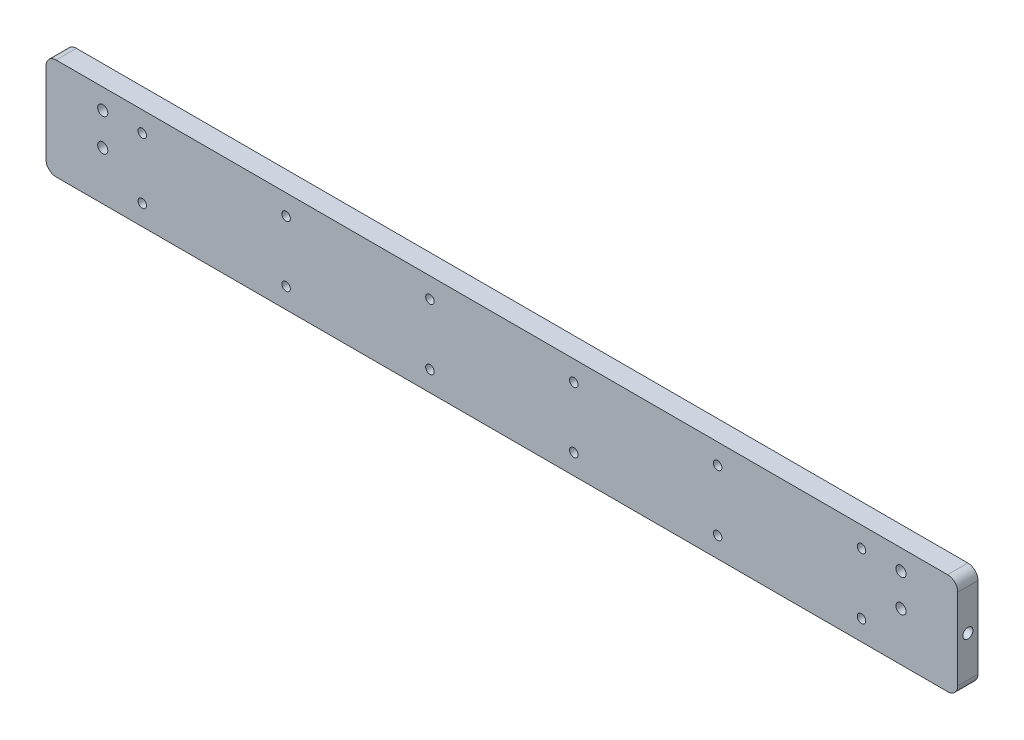
ISO-10303-21;
HEADER;
FILE_DESCRIPTION(('STEP AP214'),'2;1');
FILE_NAME('part.step','',(''),(''),'','','');
FILE_SCHEMA(('AUTOMOTIVE_DESIGN { 1 0 10303 214 1 1 1 1 }'));
ENDSEC;
DATA;
#1=APPLICATION_CONTEXT('core data for automotive mechanical design processes');
#2=APPLICATION_PROTOCOL_DEFINITION('international standard','automotive_design',2000,#1);
#3=PRODUCT_CONTEXT('',#1,'mechanical');
#4=PRODUCT('Part','Part','',(#3));
#5=PRODUCT_RELATED_PRODUCT_CATEGORY('part','',(#4));
#6=PRODUCT_DEFINITION_FORMATION('','',#4);
#7=PRODUCT_DEFINITION_CONTEXT('part definition',#1,'design');
#8=PRODUCT_DEFINITION('design','',#6,#7);
#9=PRODUCT_DEFINITION_SHAPE('','',#8);
#10=(LENGTH_UNIT() NAMED_UNIT(*) SI_UNIT(.MILLI.,.METRE.));
#11=(NAMED_UNIT(*) PLANE_ANGLE_UNIT() SI_UNIT($,.RADIAN.));
#12=(NAMED_UNIT(*) SI_UNIT($,.STERADIAN.) SOLID_ANGLE_UNIT());
#13=UNCERTAINTY_MEASURE_WITH_UNIT(LENGTH_MEASURE(1.E-05),#10,'distance_accuracy_value','');
#14=(GEOMETRIC_REPRESENTATION_CONTEXT(3) GLOBAL_UNCERTAINTY_ASSIGNED_CONTEXT((#13)) GLOBAL_UNIT_ASSIGNED_CONTEXT((#10,
#11,#12)) REPRESENTATION_CONTEXT('',''));
#15=CARTESIAN_POINT('',(0.,0.,0.));
#16=DIRECTION('',(0.,0.,1.));
#17=DIRECTION('',(1.,0.,0.));
#18=AXIS2_PLACEMENT_3D('',#15,#16,#17);
#19=CARTESIAN_POINT('',(0.,0.,10.));
#20=DIRECTION('',(1.,0.,0.));
#21=DIRECTION('',(0.,0.,-1.));
#22=AXIS2_PLACEMENT_3D('',#19,#20,#21);
#23=PLANE('',#22);
#24=CARTESIAN_POINT('',(0.,25.,5.));
#25=DIRECTION('',(-1.,0.,0.));
#26=DIRECTION('',(0.,0.,1.));
#27=AXIS2_PLACEMENT_3D('',#24,#25,#26);
#28=CIRCLE('',#27,2.5);
#29=CARTESIAN_POINT('',(0.,25.,7.49999999999999));
#30=VERTEX_POINT('',#29);
#31=EDGE_CURVE('E133',#30,#30,#28,.T.);
#32=ORIENTED_EDGE('',*,*,#31,.F.);
#33=EDGE_LOOP('',(#32));
#34=FACE_BOUND('',#33,.T.);
#35=DIRECTION('',(0.,-1.,0.));
#36=VECTOR('',#35,1.);
#37=CARTESIAN_POINT('',(0.,0.,10.));
#38=LINE('',#37,#36);
#39=CARTESIAN_POINT('',(0.,45.,10.));
#40=VERTEX_POINT('',#39);
#41=CARTESIAN_POINT('',(0.,5.,10.));
#42=VERTEX_POINT('',#41);
#43=EDGE_CURVE('E120',#40,#42,#38,.T.);
#44=ORIENTED_EDGE('',*,*,#43,.F.);
#45=DIRECTION('',(0.,0.,-1.));
#46=VECTOR('',#45,1.);
#47=CARTESIAN_POINT('',(0.,45.,10.));
#48=LINE('',#47,#46);
#49=CARTESIAN_POINT('',(0.,45.,0.));
#50=VERTEX_POINT('',#49);
#51=EDGE_CURVE('E105',#40,#50,#48,.T.);
#52=ORIENTED_EDGE('',*,*,#51,.T.);
#53=DIRECTION('',(0.,-1.,0.));
#54=VECTOR('',#53,1.);
#55=CARTESIAN_POINT('',(0.,0.,0.));
#56=LINE('',#55,#54);
#57=CARTESIAN_POINT('',(0.,5.,0.));
#58=VERTEX_POINT('',#57);
#59=EDGE_CURVE('E117',#50,#58,#56,.T.);
#60=ORIENTED_EDGE('',*,*,#59,.T.);
#61=DIRECTION('',(0.,0.,-1.));
#62=VECTOR('',#61,1.);
#63=CARTESIAN_POINT('',(0.,5.,10.));
#64=LINE('',#63,#62);
#65=EDGE_CURVE('E122',#58,#42,#64,.F.);
#66=ORIENTED_EDGE('',*,*,#65,.T.);
#67=EDGE_LOOP('',(#44,#52,#60,#66));
#68=FACE_BOUND('',#67,.T.);
#69=ADVANCED_FACE('F33',(#34,#68),#23,.F.);
#70=CARTESIAN_POINT('',(0.,0.,10.));
#71=DIRECTION('',(0.,1.,0.));
#72=DIRECTION('',(0.,0.,1.));
#73=AXIS2_PLACEMENT_3D('',#70,#71,#72);
#74=PLANE('',#73);
#75=DIRECTION('',(1.,0.,0.));
#76=VECTOR('',#75,1.);
#77=CARTESIAN_POINT('',(0.,0.,10.));
#78=LINE('',#77,#76);
#79=CARTESIAN_POINT('',(5.,0.,10.));
#80=VERTEX_POINT('',#79);
#81=CARTESIAN_POINT('',(445.,0.,10.));
#82=VERTEX_POINT('',#81);
#83=EDGE_CURVE('E218',#80,#82,#78,.T.);
#84=ORIENTED_EDGE('',*,*,#83,.F.);
#85=DIRECTION('',(0.,0.,-1.));
#86=VECTOR('',#85,1.);
#87=CARTESIAN_POINT('',(5.,0.,10.));
#88=LINE('',#87,#86);
#89=CARTESIAN_POINT('',(5.,0.,0.));
#90=VERTEX_POINT('',#89);
#91=EDGE_CURVE('E159',#80,#90,#88,.T.);
#92=ORIENTED_EDGE('',*,*,#91,.T.);
#93=DIRECTION('',(1.,0.,0.));
#94=VECTOR('',#93,1.);
#95=CARTESIAN_POINT('',(0.,0.,0.));
#96=LINE('',#95,#94);
#97=CARTESIAN_POINT('',(445.,0.,0.));
#98=VERTEX_POINT('',#97);
#99=EDGE_CURVE('E126',#90,#98,#96,.T.);
#100=ORIENTED_EDGE('',*,*,#99,.T.);
#101=DIRECTION('',(0.,0.,-1.));
#102=VECTOR('',#101,1.);
#103=CARTESIAN_POINT('',(445.,0.,10.));
#104=LINE('',#103,#102);
#105=EDGE_CURVE('E157',#98,#82,#104,.F.);
#106=ORIENTED_EDGE('',*,*,#105,.T.);
#107=EDGE_LOOP('',(#84,#92,#100,#106));
#108=FACE_BOUND('',#107,.T.);
#109=ADVANCED_FACE('F236',(#108),#74,.F.);
#110=CARTESIAN_POINT('',(450.,0.,10.));
#111=DIRECTION('',(-1.,0.,0.));
#112=DIRECTION('',(0.,0.,1.));
#113=AXIS2_PLACEMENT_3D('',#110,#111,#112);
#114=PLANE('',#113);
#115=CARTESIAN_POINT('',(450.,25.,5.));
#116=DIRECTION('',(-1.,0.,0.));
#117=DIRECTION('',(0.,0.,1.));
#118=AXIS2_PLACEMENT_3D('',#115,#116,#117);
#119=CIRCLE('',#118,2.5);
#120=CARTESIAN_POINT('',(450.,25.,7.49999999999999));
#121=VERTEX_POINT('',#120);
#122=EDGE_CURVE('E166',#121,#121,#119,.T.);
#123=ORIENTED_EDGE('',*,*,#122,.T.);
#124=EDGE_LOOP('',(#123));
#125=FACE_BOUND('',#124,.T.);
#126=DIRECTION('',(0.,1.,0.));
#127=VECTOR('',#126,1.);
#128=CARTESIAN_POINT('',(450.,0.,10.));
#129=LINE('',#128,#127);
#130=CARTESIAN_POINT('',(450.,5.,10.));
#131=VERTEX_POINT('',#130);
#132=CARTESIAN_POINT('',(450.,45.,10.));
#133=VERTEX_POINT('',#132);
#134=EDGE_CURVE('E219',#131,#133,#129,.T.);
#135=ORIENTED_EDGE('',*,*,#134,.F.);
#136=DIRECTION('',(0.,0.,-1.));
#137=VECTOR('',#136,1.);
#138=CARTESIAN_POINT('',(450.,5.,10.));
#139=LINE('',#138,#137);
#140=CARTESIAN_POINT('',(450.,5.,0.));
#141=VERTEX_POINT('',#140);
#142=EDGE_CURVE('E11',#131,#141,#139,.T.);
#143=ORIENTED_EDGE('',*,*,#142,.T.);
#144=DIRECTION('',(0.,1.,0.));
#145=VECTOR('',#144,1.);
#146=CARTESIAN_POINT('',(450.,0.,0.));
#147=LINE('',#146,#145);
#148=CARTESIAN_POINT('',(450.,45.,0.));
#149=VERTEX_POINT('',#148);
#150=EDGE_CURVE('E130',#141,#149,#147,.T.);
#151=ORIENTED_EDGE('',*,*,#150,.T.);
#152=DIRECTION('',(0.,0.,-1.));
#153=VECTOR('',#152,1.);
#154=CARTESIAN_POINT('',(450.,45.,10.));
#155=LINE('',#154,#153);
#156=EDGE_CURVE('E42',#149,#133,#155,.F.);
#157=ORIENTED_EDGE('',*,*,#156,.T.);
#158=EDGE_LOOP('',(#135,#143,#151,#157));
#159=FACE_BOUND('',#158,.T.);
#160=ADVANCED_FACE('F229',(#125,#159),#114,.F.);
#161=CARTESIAN_POINT('',(0.,50.,10.));
#162=DIRECTION('',(0.,-1.,0.));
#163=DIRECTION('',(0.,0.,-1.));
#164=AXIS2_PLACEMENT_3D('',#161,#162,#163);
#165=PLANE('',#164);
#166=DIRECTION('',(-1.,0.,0.));
#167=VECTOR('',#166,1.);
#168=CARTESIAN_POINT('',(0.,50.,0.));
#169=LINE('',#168,#167);
#170=CARTESIAN_POINT('',(445.,50.,0.));
#171=VERTEX_POINT('',#170);
#172=CARTESIAN_POINT('',(5.,50.,0.));
#173=VERTEX_POINT('',#172);
#174=EDGE_CURVE('E140',#171,#173,#169,.T.);
#175=ORIENTED_EDGE('',*,*,#174,.T.);
#176=DIRECTION('',(0.,0.,-1.));
#177=VECTOR('',#176,1.);
#178=CARTESIAN_POINT('',(5.,50.,10.));
#179=LINE('',#178,#177);
#180=CARTESIAN_POINT('',(5.,50.,10.));
#181=VERTEX_POINT('',#180);
#182=EDGE_CURVE('E106',#173,#181,#179,.F.);
#183=ORIENTED_EDGE('',*,*,#182,.T.);
#184=DIRECTION('',(-1.,0.,0.));
#185=VECTOR('',#184,1.);
#186=CARTESIAN_POINT('',(0.,50.,10.));
#187=LINE('',#186,#185);
#188=CARTESIAN_POINT('',(445.,50.,10.));
#189=VERTEX_POINT('',#188);
#190=EDGE_CURVE('E136',#189,#181,#187,.T.);
#191=ORIENTED_EDGE('',*,*,#190,.F.);
#192=DIRECTION('',(0.,0.,-1.));
#193=VECTOR('',#192,1.);
#194=CARTESIAN_POINT('',(445.,50.,10.));
#195=LINE('',#194,#193);
#196=EDGE_CURVE('E111',#189,#171,#195,.T.);
#197=ORIENTED_EDGE('',*,*,#196,.T.);
#198=EDGE_LOOP('',(#175,#183,#191,#197));
#199=FACE_BOUND('',#198,.T.);
#200=ADVANCED_FACE('F226',(#199),#165,.F.);
#201=CARTESIAN_POINT('',(0.,0.,10.));
#202=DIRECTION('',(0.,0.,-1.));
#203=DIRECTION('',(-1.,0.,0.));
#204=AXIS2_PLACEMENT_3D('',#201,#202,#203);
#205=PLANE('',#204);
#206=CARTESIAN_POINT('',(28.,24.,10.));
#207=DIRECTION('',(0.,0.,-1.));
#208=DIRECTION('',(-1.,0.,0.));
#209=AXIS2_PLACEMENT_3D('',#206,#207,#208);
#210=CIRCLE('',#209,2.5);
#211=CARTESIAN_POINT('',(25.5,24.,10.));
#212=VERTEX_POINT('',#211);
#213=EDGE_CURVE('E353',#212,#212,#210,.T.);
#214=ORIENTED_EDGE('',*,*,#213,.T.);
#215=EDGE_LOOP('',(#214));
#216=FACE_BOUND('',#215,.T.);
#217=CARTESIAN_POINT('',(422.,24.,10.));
#218=DIRECTION('',(0.,0.,-1.));
#219=DIRECTION('',(-1.,0.,0.));
#220=AXIS2_PLACEMENT_3D('',#217,#218,#219);
#221=CIRCLE('',#220,2.50000000000008);
#222=CARTESIAN_POINT('',(419.5,24.,10.));
#223=VERTEX_POINT('',#222);
#224=EDGE_CURVE('E355',#223,#223,#221,.T.);
#225=ORIENTED_EDGE('',*,*,#224,.T.);
#226=EDGE_LOOP('',(#225));
#227=FACE_BOUND('',#226,.T.);
#228=CARTESIAN_POINT('',(422.,40.,10.));
#229=DIRECTION('',(0.,0.,-1.));
#230=DIRECTION('',(-1.,0.,0.));
#231=AXIS2_PLACEMENT_3D('',#228,#229,#230);
#232=CIRCLE('',#231,2.50000000000008);
#233=CARTESIAN_POINT('',(419.5,40.,10.));
#234=VERTEX_POINT('',#233);
#235=EDGE_CURVE('E361',#234,#234,#232,.T.);
#236=ORIENTED_EDGE('',*,*,#235,.T.);
#237=EDGE_LOOP('',(#236));
#238=FACE_BOUND('',#237,.T.);
#239=CARTESIAN_POINT('',(28.,40.,10.));
#240=DIRECTION('',(0.,0.,-1.));
#241=DIRECTION('',(-1.,0.,0.));
#242=AXIS2_PLACEMENT_3D('',#239,#240,#241);
#243=CIRCLE('',#242,2.5);
#244=CARTESIAN_POINT('',(25.5,40.,10.));
#245=VERTEX_POINT('',#244);
#246=EDGE_CURVE('E358',#245,#245,#243,.T.);
#247=ORIENTED_EDGE('',*,*,#246,.T.);
#248=EDGE_LOOP('',(#247));
#249=FACE_BOUND('',#248,.T.);
#250=CARTESIAN_POINT('',(402.5,9.99999999999998,10.));
#251=DIRECTION('',(0.,0.,-1.));
#252=DIRECTION('',(1.,0.,0.));
#253=AXIS2_PLACEMENT_3D('',#250,#251,#252);
#254=CIRCLE('',#253,2.09999999999999);
#255=CARTESIAN_POINT('',(404.6,9.99999999999998,10.));
#256=VERTEX_POINT('',#255);
#257=EDGE_CURVE('E375',#256,#256,#254,.T.);
#258=ORIENTED_EDGE('',*,*,#257,.T.);
#259=EDGE_LOOP('',(#258));
#260=FACE_BOUND('',#259,.T.);
#261=CARTESIAN_POINT('',(402.5,40.,10.));
#262=DIRECTION('',(0.,0.,-1.));
#263=DIRECTION('',(-1.,0.,0.));
#264=AXIS2_PLACEMENT_3D('',#261,#262,#263);
#265=CIRCLE('',#264,2.09999999999999);
#266=CARTESIAN_POINT('',(400.4,40.,10.));
#267=VERTEX_POINT('',#266);
#268=EDGE_CURVE('E372',#267,#267,#265,.T.);
#269=ORIENTED_EDGE('',*,*,#268,.T.);
#270=EDGE_LOOP('',(#269));
#271=FACE_BOUND('',#270,.T.);
#272=CARTESIAN_POINT('',(331.5,40.,10.));
#273=DIRECTION('',(0.,0.,-1.));
#274=DIRECTION('',(1.,0.,0.));
#275=AXIS2_PLACEMENT_3D('',#272,#273,#274);
#276=CIRCLE('',#275,2.09999999999999);
#277=CARTESIAN_POINT('',(333.6,40.,10.));
#278=VERTEX_POINT('',#277);
#279=EDGE_CURVE('E368',#278,#278,#276,.T.);
#280=ORIENTED_EDGE('',*,*,#279,.T.);
#281=EDGE_LOOP('',(#280));
#282=FACE_BOUND('',#281,.T.);
#283=CARTESIAN_POINT('',(331.5,9.99999999999998,10.));
#284=DIRECTION('',(0.,0.,-1.));
#285=DIRECTION('',(-1.,0.,0.));
#286=AXIS2_PLACEMENT_3D('',#283,#284,#285);
#287=CIRCLE('',#286,2.09999999999999);
#288=CARTESIAN_POINT('',(329.4,9.99999999999998,10.));
#289=VERTEX_POINT('',#288);
#290=EDGE_CURVE('E371',#289,#289,#287,.T.);
#291=ORIENTED_EDGE('',*,*,#290,.T.);
#292=EDGE_LOOP('',(#291));
#293=FACE_BOUND('',#292,.T.);
#294=CARTESIAN_POINT('',(260.5,9.99999999999998,10.));
#295=DIRECTION('',(0.,0.,-1.));
#296=DIRECTION('',(1.,0.,0.));
#297=AXIS2_PLACEMENT_3D('',#294,#295,#296);
#298=CIRCLE('',#297,2.09999999999999);
#299=CARTESIAN_POINT('',(262.6,9.99999999999998,10.));
#300=VERTEX_POINT('',#299);
#301=EDGE_CURVE('E172',#300,#300,#298,.T.);
#302=ORIENTED_EDGE('',*,*,#301,.T.);
#303=EDGE_LOOP('',(#302));
#304=FACE_BOUND('',#303,.T.);
#305=CARTESIAN_POINT('',(189.5,40.,10.));
#306=DIRECTION('',(0.,0.,-1.));
#307=DIRECTION('',(1.,0.,0.));
#308=AXIS2_PLACEMENT_3D('',#305,#306,#307);
#309=CIRCLE('',#308,2.09999999999999);
#310=CARTESIAN_POINT('',(191.6,40.,10.));
#311=VERTEX_POINT('',#310);
#312=EDGE_CURVE('E367',#311,#311,#309,.T.);
#313=ORIENTED_EDGE('',*,*,#312,.T.);
#314=EDGE_LOOP('',(#313));
#315=FACE_BOUND('',#314,.T.);
#316=CARTESIAN_POINT('',(189.5,9.99999999999999,10.));
#317=DIRECTION('',(0.,0.,-1.));
#318=DIRECTION('',(-1.,0.,0.));
#319=AXIS2_PLACEMENT_3D('',#316,#317,#318);
#320=CIRCLE('',#319,2.09999999999999);
#321=CARTESIAN_POINT('',(187.4,9.99999999999999,10.));
#322=VERTEX_POINT('',#321);
#323=EDGE_CURVE('E386',#322,#322,#320,.T.);
#324=ORIENTED_EDGE('',*,*,#323,.T.);
#325=EDGE_LOOP('',(#324));
#326=FACE_BOUND('',#325,.T.);
#327=CARTESIAN_POINT('',(118.5,9.99999999999999,10.));
#328=DIRECTION('',(0.,0.,-1.));
#329=DIRECTION('',(1.,0.,0.));
#330=AXIS2_PLACEMENT_3D('',#327,#328,#329);
#331=CIRCLE('',#330,2.09999999999999);
#332=CARTESIAN_POINT('',(120.6,9.99999999999999,10.));
#333=VERTEX_POINT('',#332);
#334=EDGE_CURVE('E383',#333,#333,#331,.T.);
#335=ORIENTED_EDGE('',*,*,#334,.T.);
#336=EDGE_LOOP('',(#335));
#337=FACE_BOUND('',#336,.T.);
#338=CARTESIAN_POINT('',(118.5,40.,10.));
#339=DIRECTION('',(0.,0.,-1.));
#340=DIRECTION('',(-1.,0.,0.));
#341=AXIS2_PLACEMENT_3D('',#338,#339,#340);
#342=CIRCLE('',#341,2.09999999999999);
#343=CARTESIAN_POINT('',(116.4,40.,10.));
#344=VERTEX_POINT('',#343);
#345=EDGE_CURVE('E208',#344,#344,#342,.T.);
#346=ORIENTED_EDGE('',*,*,#345,.T.);
#347=EDGE_LOOP('',(#346));
#348=FACE_BOUND('',#347,.T.);
#349=CARTESIAN_POINT('',(47.5,40.,10.));
#350=DIRECTION('',(0.,0.,-1.));
#351=DIRECTION('',(1.,0.,0.));
#352=AXIS2_PLACEMENT_3D('',#349,#350,#351);
#353=CIRCLE('',#352,2.09999999999999);
#354=CARTESIAN_POINT('',(49.6,40.,10.));
#355=VERTEX_POINT('',#354);
#356=EDGE_CURVE('E392',#355,#355,#353,.T.);
#357=ORIENTED_EDGE('',*,*,#356,.T.);
#358=EDGE_LOOP('',(#357));
#359=FACE_BOUND('',#358,.T.);
#360=CARTESIAN_POINT('',(47.5,10.,10.));
#361=DIRECTION('',(0.,0.,-1.));
#362=DIRECTION('',(-1.,0.,0.));
#363=AXIS2_PLACEMENT_3D('',#360,#361,#362);
#364=CIRCLE('',#363,2.09999999999999);
#365=CARTESIAN_POINT('',(45.4,10.,10.));
#366=VERTEX_POINT('',#365);
#367=EDGE_CURVE('E378',#366,#366,#364,.T.);
#368=ORIENTED_EDGE('',*,*,#367,.T.);
#369=EDGE_LOOP('',(#368));
#370=FACE_BOUND('',#369,.T.);
#371=CARTESIAN_POINT('',(260.5,40.,10.));
#372=DIRECTION('',(0.,0.,-1.));
#373=DIRECTION('',(-1.,0.,0.));
#374=AXIS2_PLACEMENT_3D('',#371,#372,#373);
#375=CIRCLE('',#374,2.09999999999999);
#376=CARTESIAN_POINT('',(258.4,40.,10.));
#377=VERTEX_POINT('',#376);
#378=EDGE_CURVE('E167',#377,#377,#375,.T.);
#379=ORIENTED_EDGE('',*,*,#378,.T.);
#380=EDGE_LOOP('',(#379));
#381=FACE_BOUND('',#380,.T.);
#382=ORIENTED_EDGE('',*,*,#190,.T.);
#383=CARTESIAN_POINT('',(5.,45.,10.));
#384=DIRECTION('',(0.,0.,-1.));
#385=DIRECTION('',(-1.,0.,0.));
#386=AXIS2_PLACEMENT_3D('',#383,#384,#385);
#387=CIRCLE('',#386,5.);
#388=EDGE_CURVE('E155',#181,#40,#387,.F.);
#389=ORIENTED_EDGE('',*,*,#388,.T.);
#390=ORIENTED_EDGE('',*,*,#43,.T.);
#391=CARTESIAN_POINT('',(5.,5.,10.));
#392=DIRECTION('',(0.,0.,-1.));
#393=DIRECTION('',(-1.,0.,0.));
#394=AXIS2_PLACEMENT_3D('',#391,#392,#393);
#395=CIRCLE('',#394,5.);
#396=EDGE_CURVE('E153',#42,#80,#395,.F.);
#397=ORIENTED_EDGE('',*,*,#396,.T.);
#398=ORIENTED_EDGE('',*,*,#83,.T.);
#399=CARTESIAN_POINT('',(445.,5.,10.));
#400=DIRECTION('',(0.,0.,-1.));
#401=DIRECTION('',(-1.,0.,0.));
#402=AXIS2_PLACEMENT_3D('',#399,#400,#401);
#403=CIRCLE('',#402,5.);
#404=EDGE_CURVE('E56',#82,#131,#403,.F.);
#405=ORIENTED_EDGE('',*,*,#404,.T.);
#406=ORIENTED_EDGE('',*,*,#134,.T.);
#407=CARTESIAN_POINT('',(445.,45.,10.));
#408=DIRECTION('',(0.,0.,-1.));
#409=DIRECTION('',(-1.,0.,0.));
#410=AXIS2_PLACEMENT_3D('',#407,#408,#409);
#411=CIRCLE('',#410,5.);
#412=EDGE_CURVE('E150',#133,#189,#411,.F.);
#413=ORIENTED_EDGE('',*,*,#412,.T.);
#414=EDGE_LOOP('',(#382,#389,#390,#397,#398,#405,#406,#413));
#415=FACE_BOUND('',#414,.T.);
#416=ADVANCED_FACE('F223',(#216,#227,#238,#249,#260,#271,#282,#293,#304,#315,#326,#337,#348,
#359,#370,#381,#415),#205,.F.);
#417=CARTESIAN_POINT('',(0.,0.,0.));
#418=DIRECTION('',(0.,0.,-1.));
#419=DIRECTION('',(-1.,0.,0.));
#420=AXIS2_PLACEMENT_3D('',#417,#418,#419);
#421=PLANE('',#420);
#422=CARTESIAN_POINT('',(28.,24.,0.));
#423=DIRECTION('',(0.,0.,1.));
#424=DIRECTION('',(-1.,0.,0.));
#425=AXIS2_PLACEMENT_3D('',#422,#423,#424);
#426=CIRCLE('',#425,2.5);
#427=CARTESIAN_POINT('',(25.5,24.,0.));
#428=VERTEX_POINT('',#427);
#429=EDGE_CURVE('E350',#428,#428,#426,.T.);
#430=ORIENTED_EDGE('',*,*,#429,.T.);
#431=EDGE_LOOP('',(#430));
#432=FACE_BOUND('',#431,.T.);
#433=CARTESIAN_POINT('',(422.,24.,0.));
#434=DIRECTION('',(0.,0.,1.));
#435=DIRECTION('',(1.,0.,0.));
#436=AXIS2_PLACEMENT_3D('',#433,#434,#435);
#437=CIRCLE('',#436,2.50000000000008);
#438=CARTESIAN_POINT('',(424.5,24.,0.));
#439=VERTEX_POINT('',#438);
#440=EDGE_CURVE('E436',#439,#439,#437,.T.);
#441=ORIENTED_EDGE('',*,*,#440,.T.);
#442=EDGE_LOOP('',(#441));
#443=FACE_BOUND('',#442,.T.);
#444=CARTESIAN_POINT('',(422.,40.,0.));
#445=DIRECTION('',(0.,0.,1.));
#446=DIRECTION('',(-1.,0.,0.));
#447=AXIS2_PLACEMENT_3D('',#444,#445,#446);
#448=CIRCLE('',#447,2.50000000000008);
#449=CARTESIAN_POINT('',(419.5,40.,0.));
#450=VERTEX_POINT('',#449);
#451=EDGE_CURVE('E433',#450,#450,#448,.T.);
#452=ORIENTED_EDGE('',*,*,#451,.T.);
#453=EDGE_LOOP('',(#452));
#454=FACE_BOUND('',#453,.T.);
#455=CARTESIAN_POINT('',(28.,40.,0.));
#456=DIRECTION('',(0.,0.,1.));
#457=DIRECTION('',(1.,0.,0.));
#458=AXIS2_PLACEMENT_3D('',#455,#456,#457);
#459=CIRCLE('',#458,2.5);
#460=CARTESIAN_POINT('',(30.5,40.,0.));
#461=VERTEX_POINT('',#460);
#462=EDGE_CURVE('E354',#461,#461,#459,.T.);
#463=ORIENTED_EDGE('',*,*,#462,.T.);
#464=EDGE_LOOP('',(#463));
#465=FACE_BOUND('',#464,.T.);
#466=CARTESIAN_POINT('',(402.5,9.99999999999998,0.));
#467=DIRECTION('',(0.,0.,-1.));
#468=DIRECTION('',(-1.,0.,0.));
#469=AXIS2_PLACEMENT_3D('',#466,#467,#468);
#470=CIRCLE('',#469,2.09999999999999);
#471=CARTESIAN_POINT('',(400.4,9.99999999999998,0.));
#472=VERTEX_POINT('',#471);
#473=EDGE_CURVE('E37',#472,#472,#470,.T.);
#474=ORIENTED_EDGE('',*,*,#473,.F.);
#475=EDGE_LOOP('',(#474));
#476=FACE_BOUND('',#475,.T.);
#477=CARTESIAN_POINT('',(402.5,40.,0.));
#478=DIRECTION('',(0.,0.,-1.));
#479=DIRECTION('',(-1.,0.,0.));
#480=AXIS2_PLACEMENT_3D('',#477,#478,#479);
#481=CIRCLE('',#480,2.09999999999999);
#482=CARTESIAN_POINT('',(400.4,40.,0.));
#483=VERTEX_POINT('',#482);
#484=EDGE_CURVE('E195',#483,#483,#481,.T.);
#485=ORIENTED_EDGE('',*,*,#484,.F.);
#486=EDGE_LOOP('',(#485));
#487=FACE_BOUND('',#486,.T.);
#488=CARTESIAN_POINT('',(331.5,40.,0.));
#489=DIRECTION('',(0.,0.,-1.));
#490=DIRECTION('',(-1.,0.,0.));
#491=AXIS2_PLACEMENT_3D('',#488,#489,#490);
#492=CIRCLE('',#491,2.09999999999999);
#493=CARTESIAN_POINT('',(329.4,40.,0.));
#494=VERTEX_POINT('',#493);
#495=EDGE_CURVE('E193',#494,#494,#492,.T.);
#496=ORIENTED_EDGE('',*,*,#495,.F.);
#497=EDGE_LOOP('',(#496));
#498=FACE_BOUND('',#497,.T.);
#499=CARTESIAN_POINT('',(331.5,9.99999999999998,0.));
#500=DIRECTION('',(0.,0.,-1.));
#501=DIRECTION('',(-1.,0.,0.));
#502=AXIS2_PLACEMENT_3D('',#499,#500,#501);
#503=CIRCLE('',#502,2.09999999999999);
#504=CARTESIAN_POINT('',(329.4,9.99999999999998,0.));
#505=VERTEX_POINT('',#504);
#506=EDGE_CURVE('E190',#505,#505,#503,.T.);
#507=ORIENTED_EDGE('',*,*,#506,.F.);
#508=EDGE_LOOP('',(#507));
#509=FACE_BOUND('',#508,.T.);
#510=CARTESIAN_POINT('',(260.5,9.99999999999998,0.));
#511=DIRECTION('',(0.,0.,-1.));
#512=DIRECTION('',(-1.,0.,0.));
#513=AXIS2_PLACEMENT_3D('',#510,#511,#512);
#514=CIRCLE('',#513,2.09999999999999);
#515=CARTESIAN_POINT('',(258.4,9.99999999999998,0.));
#516=VERTEX_POINT('',#515);
#517=EDGE_CURVE('E187',#516,#516,#514,.T.);
#518=ORIENTED_EDGE('',*,*,#517,.F.);
#519=EDGE_LOOP('',(#518));
#520=FACE_BOUND('',#519,.T.);
#521=CARTESIAN_POINT('',(189.5,40.,0.));
#522=DIRECTION('',(0.,0.,-1.));
#523=DIRECTION('',(-1.,0.,0.));
#524=AXIS2_PLACEMENT_3D('',#521,#522,#523);
#525=CIRCLE('',#524,2.09999999999999);
#526=CARTESIAN_POINT('',(187.4,40.,0.));
#527=VERTEX_POINT('',#526);
#528=EDGE_CURVE('E184',#527,#527,#525,.T.);
#529=ORIENTED_EDGE('',*,*,#528,.F.);
#530=EDGE_LOOP('',(#529));
#531=FACE_BOUND('',#530,.T.);
#532=CARTESIAN_POINT('',(189.5,9.99999999999999,0.));
#533=DIRECTION('',(0.,0.,-1.));
#534=DIRECTION('',(-1.,0.,0.));
#535=AXIS2_PLACEMENT_3D('',#532,#533,#534);
#536=CIRCLE('',#535,2.09999999999999);
#537=CARTESIAN_POINT('',(187.4,9.99999999999999,0.));
#538=VERTEX_POINT('',#537);
#539=EDGE_CURVE('E181',#538,#538,#536,.T.);
#540=ORIENTED_EDGE('',*,*,#539,.F.);
#541=EDGE_LOOP('',(#540));
#542=FACE_BOUND('',#541,.T.);
#543=CARTESIAN_POINT('',(118.5,9.99999999999999,0.));
#544=DIRECTION('',(0.,0.,-1.));
#545=DIRECTION('',(-1.,0.,0.));
#546=AXIS2_PLACEMENT_3D('',#543,#544,#545);
#547=CIRCLE('',#546,2.09999999999999);
#548=CARTESIAN_POINT('',(116.4,9.99999999999999,0.));
#549=VERTEX_POINT('',#548);
#550=EDGE_CURVE('E178',#549,#549,#547,.T.);
#551=ORIENTED_EDGE('',*,*,#550,.F.);
#552=EDGE_LOOP('',(#551));
#553=FACE_BOUND('',#552,.T.);
#554=CARTESIAN_POINT('',(118.5,40.,0.));
#555=DIRECTION('',(0.,0.,-1.));
#556=DIRECTION('',(-1.,0.,0.));
#557=AXIS2_PLACEMENT_3D('',#554,#555,#556);
#558=CIRCLE('',#557,2.09999999999999);
#559=CARTESIAN_POINT('',(116.4,40.,0.));
#560=VERTEX_POINT('',#559);
#561=EDGE_CURVE('E175',#560,#560,#558,.T.);
#562=ORIENTED_EDGE('',*,*,#561,.F.);
#563=EDGE_LOOP('',(#562));
#564=FACE_BOUND('',#563,.T.);
#565=CARTESIAN_POINT('',(47.5,40.,0.));
#566=DIRECTION('',(0.,0.,-1.));
#567=DIRECTION('',(-1.,0.,0.));
#568=AXIS2_PLACEMENT_3D('',#565,#566,#567);
#569=CIRCLE('',#568,2.09999999999999);
#570=CARTESIAN_POINT('',(45.4,40.,0.));
#571=VERTEX_POINT('',#570);
#572=EDGE_CURVE('E171',#571,#571,#569,.T.);
#573=ORIENTED_EDGE('',*,*,#572,.F.);
#574=EDGE_LOOP('',(#573));
#575=FACE_BOUND('',#574,.T.);
#576=CARTESIAN_POINT('',(47.5,10.,0.));
#577=DIRECTION('',(0.,0.,-1.));
#578=DIRECTION('',(-1.,0.,0.));
#579=AXIS2_PLACEMENT_3D('',#576,#577,#578);
#580=CIRCLE('',#579,2.09999999999999);
#581=CARTESIAN_POINT('',(45.4,10.,0.));
#582=VERTEX_POINT('',#581);
#583=EDGE_CURVE('E168',#582,#582,#580,.T.);
#584=ORIENTED_EDGE('',*,*,#583,.F.);
#585=EDGE_LOOP('',(#584));
#586=FACE_BOUND('',#585,.T.);
#587=CARTESIAN_POINT('',(260.5,40.,0.));
#588=DIRECTION('',(0.,0.,-1.));
#589=DIRECTION('',(-1.,0.,0.));
#590=AXIS2_PLACEMENT_3D('',#587,#588,#589);
#591=CIRCLE('',#590,2.09999999999999);
#592=CARTESIAN_POINT('',(258.4,40.,0.));
#593=VERTEX_POINT('',#592);
#594=EDGE_CURVE('E163',#593,#593,#591,.T.);
#595=ORIENTED_EDGE('',*,*,#594,.F.);
#596=EDGE_LOOP('',(#595));
#597=FACE_BOUND('',#596,.T.);
#598=ORIENTED_EDGE('',*,*,#59,.F.);
#599=CARTESIAN_POINT('',(5.,45.,0.));
#600=DIRECTION('',(0.,0.,-1.));
#601=DIRECTION('',(-1.,0.,0.));
#602=AXIS2_PLACEMENT_3D('',#599,#600,#601);
#603=CIRCLE('',#602,5.);
#604=EDGE_CURVE('E101',#50,#173,#603,.T.);
#605=ORIENTED_EDGE('',*,*,#604,.T.);
#606=ORIENTED_EDGE('',*,*,#174,.F.);
#607=CARTESIAN_POINT('',(445.,45.,0.));
#608=DIRECTION('',(0.,0.,-1.));
#609=DIRECTION('',(-1.,0.,0.));
#610=AXIS2_PLACEMENT_3D('',#607,#608,#609);
#611=CIRCLE('',#610,5.);
#612=EDGE_CURVE('E121',#171,#149,#611,.T.);
#613=ORIENTED_EDGE('',*,*,#612,.T.);
#614=ORIENTED_EDGE('',*,*,#150,.F.);
#615=CARTESIAN_POINT('',(445.,5.,0.));
#616=DIRECTION('',(0.,0.,-1.));
#617=DIRECTION('',(-1.,0.,0.));
#618=AXIS2_PLACEMENT_3D('',#615,#616,#617);
#619=CIRCLE('',#618,5.);
#620=EDGE_CURVE('E144',#141,#98,#619,.T.);
#621=ORIENTED_EDGE('',*,*,#620,.T.);
#622=ORIENTED_EDGE('',*,*,#99,.F.);
#623=CARTESIAN_POINT('',(5.,5.,0.));
#624=DIRECTION('',(0.,0.,-1.));
#625=DIRECTION('',(-1.,0.,0.));
#626=AXIS2_PLACEMENT_3D('',#623,#624,#625);
#627=CIRCLE('',#626,5.);
#628=EDGE_CURVE('E112',#90,#58,#627,.T.);
#629=ORIENTED_EDGE('',*,*,#628,.T.);
#630=EDGE_LOOP('',(#598,#605,#606,#613,#614,#621,#622,#629));
#631=FACE_BOUND('',#630,.T.);
#632=ADVANCED_FACE('F124',(#432,#443,#454,#465,#476,#487,#498,#509,#520,#531,#542,#553,#564,
#575,#586,#597,#631),#421,.T.);
#633=CARTESIAN_POINT('',(16.,25.,5.));
#634=DIRECTION('',(-1.,0.,0.));
#635=DIRECTION('',(0.,0.,1.));
#636=AXIS2_PLACEMENT_3D('',#633,#634,#635);
#637=CYLINDRICAL_SURFACE('',#636,2.5);
#638=CARTESIAN_POINT('',(16.,25.,5.));
#639=DIRECTION('',(-1.,0.,0.));
#640=DIRECTION('',(0.,0.,1.));
#641=AXIS2_PLACEMENT_3D('',#638,#639,#640);
#642=CIRCLE('',#641,2.5);
#643=CARTESIAN_POINT('',(16.,25.,7.49999999999999));
#644=VERTEX_POINT('',#643);
#645=EDGE_CURVE('E127',#644,#644,#642,.T.);
#646=ORIENTED_EDGE('',*,*,#645,.F.);
#647=EDGE_LOOP('',(#646));
#648=FACE_BOUND('',#647,.T.);
#649=ORIENTED_EDGE('',*,*,#31,.T.);
#650=EDGE_LOOP('',(#649));
#651=FACE_BOUND('',#650,.T.);
#652=ADVANCED_FACE('F265',(#648,#651),#637,.F.);
#653=CARTESIAN_POINT('',(16.,25.,5.));
#654=DIRECTION('',(-1.,0.,0.));
#655=DIRECTION('',(0.,0.,1.));
#656=AXIS2_PLACEMENT_3D('',#653,#654,#655);
#657=PLANE('',#656);
#658=ORIENTED_EDGE('',*,*,#645,.T.);
#659=EDGE_LOOP('',(#658));
#660=FACE_BOUND('',#659,.T.);
#661=ADVANCED_FACE('F272',(#660),#657,.T.);
#662=CARTESIAN_POINT('',(430.,25.,5.));
#663=DIRECTION('',(1.,0.,0.));
#664=DIRECTION('',(0.,0.,-1.));
#665=AXIS2_PLACEMENT_3D('',#662,#663,#664);
#666=CYLINDRICAL_SURFACE('',#665,2.5);
#667=CARTESIAN_POINT('',(430.,25.,5.));
#668=DIRECTION('',(-1.,0.,0.));
#669=DIRECTION('',(0.,0.,1.));
#670=AXIS2_PLACEMENT_3D('',#667,#668,#669);
#671=CIRCLE('',#670,2.5);
#672=CARTESIAN_POINT('',(430.,25.,7.49999999999999));
#673=VERTEX_POINT('',#672);
#674=EDGE_CURVE('E210',#673,#673,#671,.T.);
#675=ORIENTED_EDGE('',*,*,#674,.T.);
#676=EDGE_LOOP('',(#675));
#677=FACE_BOUND('',#676,.T.);
#678=ORIENTED_EDGE('',*,*,#122,.F.);
#679=EDGE_LOOP('',(#678));
#680=FACE_BOUND('',#679,.T.);
#681=ADVANCED_FACE('F276',(#677,#680),#666,.F.);
#682=CARTESIAN_POINT('',(430.,25.,5.));
#683=DIRECTION('',(-1.,0.,0.));
#684=DIRECTION('',(0.,0.,1.));
#685=AXIS2_PLACEMENT_3D('',#682,#683,#684);
#686=PLANE('',#685);
#687=ORIENTED_EDGE('',*,*,#674,.F.);
#688=EDGE_LOOP('',(#687));
#689=FACE_BOUND('',#688,.T.);
#690=ADVANCED_FACE('F247',(#689),#686,.F.);
#691=CARTESIAN_POINT('',(5.,45.,10.));
#692=DIRECTION('',(0.,0.,-1.));
#693=DIRECTION('',(-1.,0.,0.));
#694=AXIS2_PLACEMENT_3D('',#691,#692,#693);
#695=CYLINDRICAL_SURFACE('',#694,5.);
#696=ORIENTED_EDGE('',*,*,#388,.F.);
#697=ORIENTED_EDGE('',*,*,#182,.F.);
#698=ORIENTED_EDGE('',*,*,#604,.F.);
#699=ORIENTED_EDGE('',*,*,#51,.F.);
#700=EDGE_LOOP('',(#696,#697,#698,#699));
#701=FACE_BOUND('',#700,.T.);
#702=ADVANCED_FACE('F104',(#701),#695,.T.);
#703=CARTESIAN_POINT('',(5.,5.,10.));
#704=DIRECTION('',(0.,0.,-1.));
#705=DIRECTION('',(-1.,0.,0.));
#706=AXIS2_PLACEMENT_3D('',#703,#704,#705);
#707=CYLINDRICAL_SURFACE('',#706,5.);
#708=ORIENTED_EDGE('',*,*,#396,.F.);
#709=ORIENTED_EDGE('',*,*,#65,.F.);
#710=ORIENTED_EDGE('',*,*,#628,.F.);
#711=ORIENTED_EDGE('',*,*,#91,.F.);
#712=EDGE_LOOP('',(#708,#709,#710,#711));
#713=FACE_BOUND('',#712,.T.);
#714=ADVANCED_FACE('F240',(#713),#707,.T.);
#715=CARTESIAN_POINT('',(445.,5.,10.));
#716=DIRECTION('',(0.,0.,-1.));
#717=DIRECTION('',(-1.,0.,0.));
#718=AXIS2_PLACEMENT_3D('',#715,#716,#717);
#719=CYLINDRICAL_SURFACE('',#718,5.);
#720=ORIENTED_EDGE('',*,*,#404,.F.);
#721=ORIENTED_EDGE('',*,*,#105,.F.);
#722=ORIENTED_EDGE('',*,*,#620,.F.);
#723=ORIENTED_EDGE('',*,*,#142,.F.);
#724=EDGE_LOOP('',(#720,#721,#722,#723));
#725=FACE_BOUND('',#724,.T.);
#726=ADVANCED_FACE('F232',(#725),#719,.T.);
#727=CARTESIAN_POINT('',(445.,45.,10.));
#728=DIRECTION('',(0.,0.,-1.));
#729=DIRECTION('',(-1.,0.,0.));
#730=AXIS2_PLACEMENT_3D('',#727,#728,#729);
#731=CYLINDRICAL_SURFACE('',#730,5.);
#732=ORIENTED_EDGE('',*,*,#412,.F.);
#733=ORIENTED_EDGE('',*,*,#156,.F.);
#734=ORIENTED_EDGE('',*,*,#612,.F.);
#735=ORIENTED_EDGE('',*,*,#196,.F.);
#736=EDGE_LOOP('',(#732,#733,#734,#735));
#737=FACE_BOUND('',#736,.T.);
#738=ADVANCED_FACE('F35',(#737),#731,.T.);
#739=CARTESIAN_POINT('',(260.5,40.,10.));
#740=DIRECTION('',(0.,0.,-1.));
#741=DIRECTION('',(-1.,0.,0.));
#742=AXIS2_PLACEMENT_3D('',#739,#740,#741);
#743=CYLINDRICAL_SURFACE('',#742,2.09999999999999);
#744=ORIENTED_EDGE('',*,*,#594,.T.);
#745=EDGE_LOOP('',(#744));
#746=FACE_BOUND('',#745,.T.);
#747=ORIENTED_EDGE('',*,*,#378,.F.);
#748=EDGE_LOOP('',(#747));
#749=FACE_BOUND('',#748,.T.);
#750=ADVANCED_FACE('F284',(#746,#749),#743,.F.);
#751=CARTESIAN_POINT('',(47.5,10.,10.));
#752=DIRECTION('',(0.,0.,-1.));
#753=DIRECTION('',(-1.,0.,0.));
#754=AXIS2_PLACEMENT_3D('',#751,#752,#753);
#755=CYLINDRICAL_SURFACE('',#754,2.09999999999999);
#756=ORIENTED_EDGE('',*,*,#583,.T.);
#757=EDGE_LOOP('',(#756));
#758=FACE_BOUND('',#757,.T.);
#759=ORIENTED_EDGE('',*,*,#367,.F.);
#760=EDGE_LOOP('',(#759));
#761=FACE_BOUND('',#760,.T.);
#762=ADVANCED_FACE('F287',(#758,#761),#755,.F.);
#763=CARTESIAN_POINT('',(47.5,40.,10.));
#764=DIRECTION('',(0.,0.,-1.));
#765=DIRECTION('',(-1.,0.,0.));
#766=AXIS2_PLACEMENT_3D('',#763,#764,#765);
#767=CYLINDRICAL_SURFACE('',#766,2.09999999999999);
#768=ORIENTED_EDGE('',*,*,#572,.T.);
#769=EDGE_LOOP('',(#768));
#770=FACE_BOUND('',#769,.T.);
#771=ORIENTED_EDGE('',*,*,#356,.F.);
#772=EDGE_LOOP('',(#771));
#773=FACE_BOUND('',#772,.T.);
#774=ADVANCED_FACE('F293',(#770,#773),#767,.F.);
#775=CARTESIAN_POINT('',(118.5,40.,10.));
#776=DIRECTION('',(0.,0.,-1.));
#777=DIRECTION('',(-1.,0.,0.));
#778=AXIS2_PLACEMENT_3D('',#775,#776,#777);
#779=CYLINDRICAL_SURFACE('',#778,2.09999999999999);
#780=ORIENTED_EDGE('',*,*,#561,.T.);
#781=EDGE_LOOP('',(#780));
#782=FACE_BOUND('',#781,.T.);
#783=ORIENTED_EDGE('',*,*,#345,.F.);
#784=EDGE_LOOP('',(#783));
#785=FACE_BOUND('',#784,.T.);
#786=ADVANCED_FACE('F289',(#782,#785),#779,.F.);
#787=CARTESIAN_POINT('',(118.5,9.99999999999999,10.));
#788=DIRECTION('',(0.,0.,-1.));
#789=DIRECTION('',(-1.,0.,0.));
#790=AXIS2_PLACEMENT_3D('',#787,#788,#789);
#791=CYLINDRICAL_SURFACE('',#790,2.09999999999999);
#792=ORIENTED_EDGE('',*,*,#550,.T.);
#793=EDGE_LOOP('',(#792));
#794=FACE_BOUND('',#793,.T.);
#795=ORIENTED_EDGE('',*,*,#334,.F.);
#796=EDGE_LOOP('',(#795));
#797=FACE_BOUND('',#796,.T.);
#798=ADVANCED_FACE('F292',(#794,#797),#791,.F.);
#799=CARTESIAN_POINT('',(189.5,9.99999999999999,10.));
#800=DIRECTION('',(0.,0.,-1.));
#801=DIRECTION('',(-1.,0.,0.));
#802=AXIS2_PLACEMENT_3D('',#799,#800,#801);
#803=CYLINDRICAL_SURFACE('',#802,2.09999999999999);
#804=ORIENTED_EDGE('',*,*,#539,.T.);
#805=EDGE_LOOP('',(#804));
#806=FACE_BOUND('',#805,.T.);
#807=ORIENTED_EDGE('',*,*,#323,.F.);
#808=EDGE_LOOP('',(#807));
#809=FACE_BOUND('',#808,.T.);
#810=ADVANCED_FACE('F305',(#806,#809),#803,.F.);
#811=CARTESIAN_POINT('',(189.5,40.,10.));
#812=DIRECTION('',(0.,0.,-1.));
#813=DIRECTION('',(-1.,0.,0.));
#814=AXIS2_PLACEMENT_3D('',#811,#812,#813);
#815=CYLINDRICAL_SURFACE('',#814,2.09999999999999);
#816=ORIENTED_EDGE('',*,*,#528,.T.);
#817=EDGE_LOOP('',(#816));
#818=FACE_BOUND('',#817,.T.);
#819=ORIENTED_EDGE('',*,*,#312,.F.);
#820=EDGE_LOOP('',(#819));
#821=FACE_BOUND('',#820,.T.);
#822=ADVANCED_FACE('F301',(#818,#821),#815,.F.);
#823=CARTESIAN_POINT('',(260.5,9.99999999999998,10.));
#824=DIRECTION('',(0.,0.,-1.));
#825=DIRECTION('',(-1.,0.,0.));
#826=AXIS2_PLACEMENT_3D('',#823,#824,#825);
#827=CYLINDRICAL_SURFACE('',#826,2.09999999999999);
#828=ORIENTED_EDGE('',*,*,#517,.T.);
#829=EDGE_LOOP('',(#828));
#830=FACE_BOUND('',#829,.T.);
#831=ORIENTED_EDGE('',*,*,#301,.F.);
#832=EDGE_LOOP('',(#831));
#833=FACE_BOUND('',#832,.T.);
#834=ADVANCED_FACE('F304',(#830,#833),#827,.F.);
#835=CARTESIAN_POINT('',(331.5,9.99999999999998,10.));
#836=DIRECTION('',(0.,0.,-1.));
#837=DIRECTION('',(-1.,0.,0.));
#838=AXIS2_PLACEMENT_3D('',#835,#836,#837);
#839=CYLINDRICAL_SURFACE('',#838,2.09999999999999);
#840=ORIENTED_EDGE('',*,*,#506,.T.);
#841=EDGE_LOOP('',(#840));
#842=FACE_BOUND('',#841,.T.);
#843=ORIENTED_EDGE('',*,*,#290,.F.);
#844=EDGE_LOOP('',(#843));
#845=FACE_BOUND('',#844,.T.);
#846=ADVANCED_FACE('F313',(#842,#845),#839,.F.);
#847=CARTESIAN_POINT('',(331.5,40.,10.));
#848=DIRECTION('',(0.,0.,-1.));
#849=DIRECTION('',(-1.,0.,0.));
#850=AXIS2_PLACEMENT_3D('',#847,#848,#849);
#851=CYLINDRICAL_SURFACE('',#850,2.09999999999999);
#852=ORIENTED_EDGE('',*,*,#495,.T.);
#853=EDGE_LOOP('',(#852));
#854=FACE_BOUND('',#853,.T.);
#855=ORIENTED_EDGE('',*,*,#279,.F.);
#856=EDGE_LOOP('',(#855));
#857=FACE_BOUND('',#856,.T.);
#858=ADVANCED_FACE('F316',(#854,#857),#851,.F.);
#859=CARTESIAN_POINT('',(402.5,40.,10.));
#860=DIRECTION('',(0.,0.,-1.));
#861=DIRECTION('',(-1.,0.,0.));
#862=AXIS2_PLACEMENT_3D('',#859,#860,#861);
#863=CYLINDRICAL_SURFACE('',#862,2.09999999999999);
#864=ORIENTED_EDGE('',*,*,#484,.T.);
#865=EDGE_LOOP('',(#864));
#866=FACE_BOUND('',#865,.T.);
#867=ORIENTED_EDGE('',*,*,#268,.F.);
#868=EDGE_LOOP('',(#867));
#869=FACE_BOUND('',#868,.T.);
#870=ADVANCED_FACE('F325',(#866,#869),#863,.F.);
#871=CARTESIAN_POINT('',(402.5,9.99999999999998,10.));
#872=DIRECTION('',(0.,0.,-1.));
#873=DIRECTION('',(-1.,0.,0.));
#874=AXIS2_PLACEMENT_3D('',#871,#872,#873);
#875=CYLINDRICAL_SURFACE('',#874,2.09999999999999);
#876=ORIENTED_EDGE('',*,*,#473,.T.);
#877=EDGE_LOOP('',(#876));
#878=FACE_BOUND('',#877,.T.);
#879=ORIENTED_EDGE('',*,*,#257,.F.);
#880=EDGE_LOOP('',(#879));
#881=FACE_BOUND('',#880,.T.);
#882=ADVANCED_FACE('F321',(#878,#881),#875,.F.);
#883=CARTESIAN_POINT('',(28.,40.,0.));
#884=DIRECTION('',(0.,0.,1.));
#885=DIRECTION('',(1.,0.,0.));
#886=AXIS2_PLACEMENT_3D('',#883,#884,#885);
#887=CYLINDRICAL_SURFACE('',#886,2.5);
#888=ORIENTED_EDGE('',*,*,#462,.F.);
#889=EDGE_LOOP('',(#888));
#890=FACE_BOUND('',#889,.T.);
#891=ORIENTED_EDGE('',*,*,#246,.F.);
#892=EDGE_LOOP('',(#891));
#893=FACE_BOUND('',#892,.T.);
#894=ADVANCED_FACE('F324',(#890,#893),#887,.F.);
#895=CARTESIAN_POINT('',(422.,40.,0.));
#896=DIRECTION('',(0.,0.,1.));
#897=DIRECTION('',(1.,0.,0.));
#898=AXIS2_PLACEMENT_3D('',#895,#896,#897);
#899=CYLINDRICAL_SURFACE('',#898,2.50000000000008);
#900=ORIENTED_EDGE('',*,*,#451,.F.);
#901=EDGE_LOOP('',(#900));
#902=FACE_BOUND('',#901,.T.);
#903=ORIENTED_EDGE('',*,*,#235,.F.);
#904=EDGE_LOOP('',(#903));
#905=FACE_BOUND('',#904,.T.);
#906=ADVANCED_FACE('F333',(#902,#905),#899,.F.);
#907=CARTESIAN_POINT('',(422.,24.,0.));
#908=DIRECTION('',(0.,0.,1.));
#909=DIRECTION('',(1.,0.,0.));
#910=AXIS2_PLACEMENT_3D('',#907,#908,#909);
#911=CYLINDRICAL_SURFACE('',#910,2.50000000000008);
#912=ORIENTED_EDGE('',*,*,#440,.F.);
#913=EDGE_LOOP('',(#912));
#914=FACE_BOUND('',#913,.T.);
#915=ORIENTED_EDGE('',*,*,#224,.F.);
#916=EDGE_LOOP('',(#915));
#917=FACE_BOUND('',#916,.T.);
#918=ADVANCED_FACE('F337',(#914,#917),#911,.F.);
#919=CARTESIAN_POINT('',(28.,24.,0.));
#920=DIRECTION('',(0.,0.,1.));
#921=DIRECTION('',(1.,0.,0.));
#922=AXIS2_PLACEMENT_3D('',#919,#920,#921);
#923=CYLINDRICAL_SURFACE('',#922,2.5);
#924=ORIENTED_EDGE('',*,*,#429,.F.);
#925=EDGE_LOOP('',(#924));
#926=FACE_BOUND('',#925,.T.);
#927=ORIENTED_EDGE('',*,*,#213,.F.);
#928=EDGE_LOOP('',(#927));
#929=FACE_BOUND('',#928,.T.);
#930=ADVANCED_FACE('F341',(#926,#929),#923,.F.);
#931=CLOSED_SHELL('',(#69,#109,#160,#200,#416,#632,#652,#661,#681,#690,#702,#714,#726,#738,#750,
#762,#774,#786,#798,#810,#822,#834,#846,#858,#870,#882,#894,#906,#918,#930));
#932=MANIFOLD_SOLID_BREP('B2',#931);
#933=ADVANCED_BREP_SHAPE_REPRESENTATION('',(#18,#932),#14);
#934=SHAPE_DEFINITION_REPRESENTATION(#9,#933);
ENDSEC;
END-ISO-10303-21;
